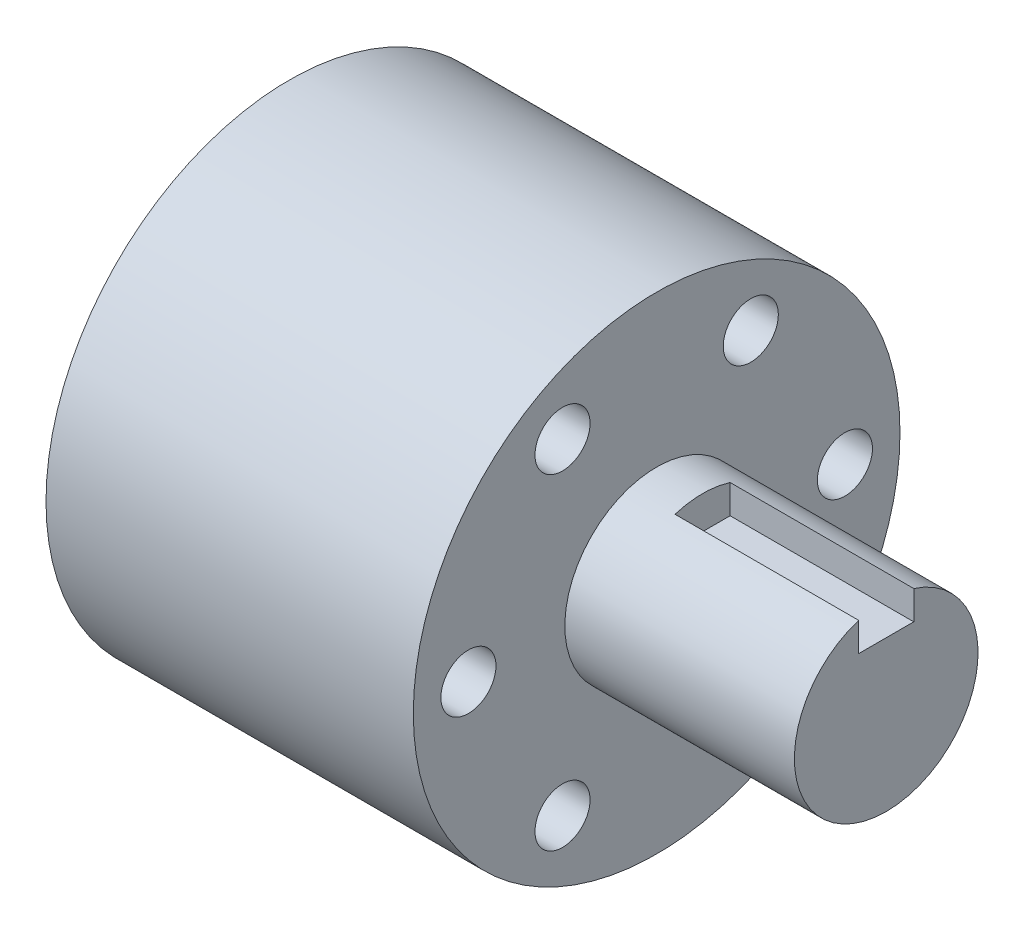
ISO-10303-21;
HEADER;
FILE_DESCRIPTION(('STEP AP214'),'2;1');
FILE_NAME('part.step','',(''),(''),'','','');
FILE_SCHEMA(('AUTOMOTIVE_DESIGN { 1 0 10303 214 1 1 1 1 }'));
ENDSEC;
DATA;
#1=APPLICATION_CONTEXT('core data for automotive mechanical design processes');
#2=APPLICATION_PROTOCOL_DEFINITION('international standard','automotive_design',2000,#1);
#3=PRODUCT_CONTEXT('',#1,'mechanical');
#4=PRODUCT('Part','Part','',(#3));
#5=PRODUCT_RELATED_PRODUCT_CATEGORY('part','',(#4));
#6=PRODUCT_DEFINITION_FORMATION('','',#4);
#7=PRODUCT_DEFINITION_CONTEXT('part definition',#1,'design');
#8=PRODUCT_DEFINITION('design','',#6,#7);
#9=PRODUCT_DEFINITION_SHAPE('','',#8);
#10=(LENGTH_UNIT() NAMED_UNIT(*) SI_UNIT(.MILLI.,.METRE.));
#11=(NAMED_UNIT(*) PLANE_ANGLE_UNIT() SI_UNIT($,.RADIAN.));
#12=(NAMED_UNIT(*) SI_UNIT($,.STERADIAN.) SOLID_ANGLE_UNIT());
#13=UNCERTAINTY_MEASURE_WITH_UNIT(LENGTH_MEASURE(1.E-05),#10,'distance_accuracy_value','');
#14=(GEOMETRIC_REPRESENTATION_CONTEXT(3) GLOBAL_UNCERTAINTY_ASSIGNED_CONTEXT((#13)) GLOBAL_UNIT_ASSIGNED_CONTEXT((#10,
#11,#12)) REPRESENTATION_CONTEXT('',''));
#15=CARTESIAN_POINT('',(0.,0.,0.));
#16=DIRECTION('',(0.,0.,1.));
#17=DIRECTION('',(1.,0.,0.));
#18=AXIS2_PLACEMENT_3D('',#15,#16,#17);
#19=CARTESIAN_POINT('',(20.,0.,0.));
#20=DIRECTION('',(-1.,0.,0.));
#21=DIRECTION('',(0.,0.,1.));
#22=AXIS2_PLACEMENT_3D('',#19,#20,#21);
#23=CYLINDRICAL_SURFACE('',#22,13.25);
#24=CARTESIAN_POINT('',(20.,0.,0.));
#25=DIRECTION('',(1.,0.,0.));
#26=DIRECTION('',(0.,0.,-1.));
#27=AXIS2_PLACEMENT_3D('',#24,#25,#26);
#28=CIRCLE('',#27,13.25);
#29=CARTESIAN_POINT('',(20.,0.,-13.25));
#30=VERTEX_POINT('',#29);
#31=EDGE_CURVE('E11',#30,#30,#28,.T.);
#32=ORIENTED_EDGE('',*,*,#31,.F.);
#33=EDGE_LOOP('',(#32));
#34=FACE_BOUND('',#33,.T.);
#35=CARTESIAN_POINT('',(0.,0.,0.));
#36=DIRECTION('',(1.,0.,0.));
#37=DIRECTION('',(0.,0.,-1.));
#38=AXIS2_PLACEMENT_3D('',#35,#36,#37);
#39=CIRCLE('',#38,13.25);
#40=CARTESIAN_POINT('',(0.,0.,-13.25));
#41=VERTEX_POINT('',#40);
#42=EDGE_CURVE('E38',#41,#41,#39,.T.);
#43=ORIENTED_EDGE('',*,*,#42,.T.);
#44=EDGE_LOOP('',(#43));
#45=FACE_BOUND('',#44,.T.);
#46=ADVANCED_FACE('F35',(#34,#45),#23,.T.);
#47=CARTESIAN_POINT('',(20.,0.,0.));
#48=DIRECTION('',(1.,0.,0.));
#49=DIRECTION('',(0.,0.,-1.));
#50=AXIS2_PLACEMENT_3D('',#47,#48,#49);
#51=PLANE('',#50);
#52=CARTESIAN_POINT('',(20.,0.,0.));
#53=DIRECTION('',(1.,0.,0.));
#54=DIRECTION('',(0.,0.,-1.));
#55=AXIS2_PLACEMENT_3D('',#52,#53,#54);
#56=CIRCLE('',#55,5.);
#57=CARTESIAN_POINT('',(20.,0.,-5.));
#58=VERTEX_POINT('',#57);
#59=EDGE_CURVE('E106',#58,#58,#56,.T.);
#60=ORIENTED_EDGE('',*,*,#59,.F.);
#61=EDGE_LOOP('',(#60));
#62=FACE_BOUND('',#61,.T.);
#63=CARTESIAN_POINT('',(20.,-8.87676038879051,-5.12499999999998));
#64=DIRECTION('',(1.,0.,0.));
#65=DIRECTION('',(0.,0.,-1.));
#66=AXIS2_PLACEMENT_3D('',#63,#64,#65);
#67=CIRCLE('',#66,1.5);
#68=CARTESIAN_POINT('',(20.,-8.87676038879051,-6.62499999999998));
#69=VERTEX_POINT('',#68);
#70=EDGE_CURVE('E119',#69,#69,#67,.T.);
#71=ORIENTED_EDGE('',*,*,#70,.F.);
#72=EDGE_LOOP('',(#71));
#73=FACE_BOUND('',#72,.T.);
#74=CARTESIAN_POINT('',(20.,-8.87676038879047,5.12500000000004));
#75=DIRECTION('',(1.,0.,0.));
#76=DIRECTION('',(0.,0.,-1.));
#77=AXIS2_PLACEMENT_3D('',#74,#75,#76);
#78=CIRCLE('',#77,1.5);
#79=CARTESIAN_POINT('',(20.,-8.87676038879047,3.62500000000004));
#80=VERTEX_POINT('',#79);
#81=EDGE_CURVE('E125',#80,#80,#78,.T.);
#82=ORIENTED_EDGE('',*,*,#81,.F.);
#83=EDGE_LOOP('',(#82));
#84=FACE_BOUND('',#83,.T.);
#85=CARTESIAN_POINT('',(20.,0.,10.25));
#86=DIRECTION('',(1.,0.,0.));
#87=DIRECTION('',(0.,0.,-1.));
#88=AXIS2_PLACEMENT_3D('',#85,#86,#87);
#89=CIRCLE('',#88,1.5);
#90=CARTESIAN_POINT('',(20.,0.,8.75));
#91=VERTEX_POINT('',#90);
#92=EDGE_CURVE('E131',#91,#91,#89,.T.);
#93=ORIENTED_EDGE('',*,*,#92,.F.);
#94=EDGE_LOOP('',(#93));
#95=FACE_BOUND('',#94,.T.);
#96=CARTESIAN_POINT('',(20.,8.87676038879054,5.12499999999992));
#97=DIRECTION('',(1.,0.,0.));
#98=DIRECTION('',(0.,0.,-1.));
#99=AXIS2_PLACEMENT_3D('',#96,#97,#98);
#100=CIRCLE('',#99,1.5);
#101=CARTESIAN_POINT('',(20.,8.87676038879054,3.62499999999992));
#102=VERTEX_POINT('',#101);
#103=EDGE_CURVE('E137',#102,#102,#100,.T.);
#104=ORIENTED_EDGE('',*,*,#103,.F.);
#105=EDGE_LOOP('',(#104));
#106=FACE_BOUND('',#105,.T.);
#107=CARTESIAN_POINT('',(20.,8.87676038879044,-5.1250000000001));
#108=DIRECTION('',(1.,0.,0.));
#109=DIRECTION('',(0.,0.,-1.));
#110=AXIS2_PLACEMENT_3D('',#107,#108,#109);
#111=CIRCLE('',#110,1.5);
#112=CARTESIAN_POINT('',(20.,8.87676038879044,-6.6250000000001));
#113=VERTEX_POINT('',#112);
#114=EDGE_CURVE('E112',#113,#113,#111,.T.);
#115=ORIENTED_EDGE('',*,*,#114,.F.);
#116=EDGE_LOOP('',(#115));
#117=FACE_BOUND('',#116,.T.);
#118=CARTESIAN_POINT('',(20.,0.,-10.25));
#119=DIRECTION('',(1.,0.,0.));
#120=DIRECTION('',(0.,0.,-1.));
#121=AXIS2_PLACEMENT_3D('',#118,#119,#120);
#122=CIRCLE('',#121,1.5);
#123=CARTESIAN_POINT('',(20.,0.,-11.75));
#124=VERTEX_POINT('',#123);
#125=EDGE_CURVE('E118',#124,#124,#122,.T.);
#126=ORIENTED_EDGE('',*,*,#125,.F.);
#127=EDGE_LOOP('',(#126));
#128=FACE_BOUND('',#127,.T.);
#129=ORIENTED_EDGE('',*,*,#31,.T.);
#130=EDGE_LOOP('',(#129));
#131=FACE_BOUND('',#130,.T.);
#132=ADVANCED_FACE('F153',(#62,#73,#84,#95,#106,#117,#128,#131),#51,.T.);
#133=CARTESIAN_POINT('',(0.,0.,0.));
#134=DIRECTION('',(1.,0.,0.));
#135=DIRECTION('',(0.,0.,-1.));
#136=AXIS2_PLACEMENT_3D('',#133,#134,#135);
#137=PLANE('',#136);
#138=ORIENTED_EDGE('',*,*,#42,.F.);
#139=EDGE_LOOP('',(#138));
#140=FACE_BOUND('',#139,.T.);
#141=ADVANCED_FACE('F156',(#140),#137,.F.);
#142=CARTESIAN_POINT('',(15.,0.,-10.25));
#143=DIRECTION('',(1.,0.,0.));
#144=DIRECTION('',(0.,0.,-1.));
#145=AXIS2_PLACEMENT_3D('',#142,#143,#144);
#146=CYLINDRICAL_SURFACE('',#145,1.5);
#147=CARTESIAN_POINT('',(15.,0.,-10.25));
#148=DIRECTION('',(1.,0.,0.));
#149=DIRECTION('',(0.,0.,-1.));
#150=AXIS2_PLACEMENT_3D('',#147,#148,#149);
#151=CIRCLE('',#150,1.5);
#152=CARTESIAN_POINT('',(15.,0.,-11.75));
#153=VERTEX_POINT('',#152);
#154=EDGE_CURVE('E145',#153,#153,#151,.T.);
#155=ORIENTED_EDGE('',*,*,#154,.F.);
#156=EDGE_LOOP('',(#155));
#157=FACE_BOUND('',#156,.T.);
#158=ORIENTED_EDGE('',*,*,#125,.T.);
#159=EDGE_LOOP('',(#158));
#160=FACE_BOUND('',#159,.T.);
#161=ADVANCED_FACE('F151',(#157,#160),#146,.F.);
#162=CARTESIAN_POINT('',(15.,0.,-10.25));
#163=DIRECTION('',(1.,0.,0.));
#164=DIRECTION('',(0.,0.,-1.));
#165=AXIS2_PLACEMENT_3D('',#162,#163,#164);
#166=PLANE('',#165);
#167=ORIENTED_EDGE('',*,*,#154,.T.);
#168=EDGE_LOOP('',(#167));
#169=FACE_BOUND('',#168,.T.);
#170=ADVANCED_FACE('F170',(#169),#166,.T.);
#171=CARTESIAN_POINT('',(15.,8.87676038879044,-5.1250000000001));
#172=DIRECTION('',(1.,0.,0.));
#173=DIRECTION('',(0.,0.,-1.));
#174=AXIS2_PLACEMENT_3D('',#171,#172,#173);
#175=CYLINDRICAL_SURFACE('',#174,1.5);
#176=CARTESIAN_POINT('',(15.,8.87676038879044,-5.1250000000001));
#177=DIRECTION('',(1.,0.,0.));
#178=DIRECTION('',(0.,0.,-1.));
#179=AXIS2_PLACEMENT_3D('',#176,#177,#178);
#180=CIRCLE('',#179,1.5);
#181=CARTESIAN_POINT('',(15.,8.87676038879044,-6.6250000000001));
#182=VERTEX_POINT('',#181);
#183=EDGE_CURVE('E140',#182,#182,#180,.T.);
#184=ORIENTED_EDGE('',*,*,#183,.F.);
#185=EDGE_LOOP('',(#184));
#186=FACE_BOUND('',#185,.T.);
#187=ORIENTED_EDGE('',*,*,#114,.T.);
#188=EDGE_LOOP('',(#187));
#189=FACE_BOUND('',#188,.T.);
#190=ADVANCED_FACE('F176',(#186,#189),#175,.F.);
#191=CARTESIAN_POINT('',(15.,8.87676038879044,-5.1250000000001));
#192=DIRECTION('',(1.,0.,0.));
#193=DIRECTION('',(0.,0.,-1.));
#194=AXIS2_PLACEMENT_3D('',#191,#192,#193);
#195=PLANE('',#194);
#196=ORIENTED_EDGE('',*,*,#183,.T.);
#197=EDGE_LOOP('',(#196));
#198=FACE_BOUND('',#197,.T.);
#199=ADVANCED_FACE('F180',(#198),#195,.T.);
#200=CARTESIAN_POINT('',(15.,8.87676038879054,5.12499999999992));
#201=DIRECTION('',(1.,0.,0.));
#202=DIRECTION('',(0.,0.,-1.));
#203=AXIS2_PLACEMENT_3D('',#200,#201,#202);
#204=CYLINDRICAL_SURFACE('',#203,1.5);
#205=CARTESIAN_POINT('',(15.,8.87676038879054,5.12499999999992));
#206=DIRECTION('',(1.,0.,0.));
#207=DIRECTION('',(0.,0.,-1.));
#208=AXIS2_PLACEMENT_3D('',#205,#206,#207);
#209=CIRCLE('',#208,1.5);
#210=CARTESIAN_POINT('',(15.,8.87676038879054,3.62499999999992));
#211=VERTEX_POINT('',#210);
#212=EDGE_CURVE('E134',#211,#211,#209,.T.);
#213=ORIENTED_EDGE('',*,*,#212,.F.);
#214=EDGE_LOOP('',(#213));
#215=FACE_BOUND('',#214,.T.);
#216=ORIENTED_EDGE('',*,*,#103,.T.);
#217=EDGE_LOOP('',(#216));
#218=FACE_BOUND('',#217,.T.);
#219=ADVANCED_FACE('F184',(#215,#218),#204,.F.);
#220=CARTESIAN_POINT('',(15.,8.87676038879054,5.12499999999992));
#221=DIRECTION('',(1.,0.,0.));
#222=DIRECTION('',(0.,0.,-1.));
#223=AXIS2_PLACEMENT_3D('',#220,#221,#222);
#224=PLANE('',#223);
#225=ORIENTED_EDGE('',*,*,#212,.T.);
#226=EDGE_LOOP('',(#225));
#227=FACE_BOUND('',#226,.T.);
#228=ADVANCED_FACE('F188',(#227),#224,.T.);
#229=CARTESIAN_POINT('',(15.,0.,10.25));
#230=DIRECTION('',(1.,0.,0.));
#231=DIRECTION('',(0.,0.,-1.));
#232=AXIS2_PLACEMENT_3D('',#229,#230,#231);
#233=CYLINDRICAL_SURFACE('',#232,1.5);
#234=CARTESIAN_POINT('',(15.,0.,10.25));
#235=DIRECTION('',(1.,0.,0.));
#236=DIRECTION('',(0.,0.,-1.));
#237=AXIS2_PLACEMENT_3D('',#234,#235,#236);
#238=CIRCLE('',#237,1.5);
#239=CARTESIAN_POINT('',(15.,0.,8.75));
#240=VERTEX_POINT('',#239);
#241=EDGE_CURVE('E128',#240,#240,#238,.T.);
#242=ORIENTED_EDGE('',*,*,#241,.F.);
#243=EDGE_LOOP('',(#242));
#244=FACE_BOUND('',#243,.T.);
#245=ORIENTED_EDGE('',*,*,#92,.T.);
#246=EDGE_LOOP('',(#245));
#247=FACE_BOUND('',#246,.T.);
#248=ADVANCED_FACE('F192',(#244,#247),#233,.F.);
#249=CARTESIAN_POINT('',(15.,0.,10.25));
#250=DIRECTION('',(1.,0.,0.));
#251=DIRECTION('',(0.,0.,-1.));
#252=AXIS2_PLACEMENT_3D('',#249,#250,#251);
#253=PLANE('',#252);
#254=ORIENTED_EDGE('',*,*,#241,.T.);
#255=EDGE_LOOP('',(#254));
#256=FACE_BOUND('',#255,.T.);
#257=ADVANCED_FACE('F196',(#256),#253,.T.);
#258=CARTESIAN_POINT('',(15.,-8.87676038879047,5.12500000000004));
#259=DIRECTION('',(1.,0.,0.));
#260=DIRECTION('',(0.,0.,-1.));
#261=AXIS2_PLACEMENT_3D('',#258,#259,#260);
#262=CYLINDRICAL_SURFACE('',#261,1.5);
#263=CARTESIAN_POINT('',(15.,-8.87676038879047,5.12500000000004));
#264=DIRECTION('',(1.,0.,0.));
#265=DIRECTION('',(0.,0.,-1.));
#266=AXIS2_PLACEMENT_3D('',#263,#264,#265);
#267=CIRCLE('',#266,1.5);
#268=CARTESIAN_POINT('',(15.,-8.87676038879047,3.62500000000004));
#269=VERTEX_POINT('',#268);
#270=EDGE_CURVE('E122',#269,#269,#267,.T.);
#271=ORIENTED_EDGE('',*,*,#270,.F.);
#272=EDGE_LOOP('',(#271));
#273=FACE_BOUND('',#272,.T.);
#274=ORIENTED_EDGE('',*,*,#81,.T.);
#275=EDGE_LOOP('',(#274));
#276=FACE_BOUND('',#275,.T.);
#277=ADVANCED_FACE('F200',(#273,#276),#262,.F.);
#278=CARTESIAN_POINT('',(15.,-8.87676038879047,5.12500000000004));
#279=DIRECTION('',(1.,0.,0.));
#280=DIRECTION('',(0.,0.,-1.));
#281=AXIS2_PLACEMENT_3D('',#278,#279,#280);
#282=PLANE('',#281);
#283=ORIENTED_EDGE('',*,*,#270,.T.);
#284=EDGE_LOOP('',(#283));
#285=FACE_BOUND('',#284,.T.);
#286=ADVANCED_FACE('F204',(#285),#282,.T.);
#287=CARTESIAN_POINT('',(15.,-8.87676038879051,-5.12499999999998));
#288=DIRECTION('',(1.,0.,0.));
#289=DIRECTION('',(0.,0.,-1.));
#290=AXIS2_PLACEMENT_3D('',#287,#288,#289);
#291=CYLINDRICAL_SURFACE('',#290,1.5);
#292=CARTESIAN_POINT('',(15.,-8.87676038879051,-5.12499999999998));
#293=DIRECTION('',(1.,0.,0.));
#294=DIRECTION('',(0.,0.,-1.));
#295=AXIS2_PLACEMENT_3D('',#292,#293,#294);
#296=CIRCLE('',#295,1.5);
#297=CARTESIAN_POINT('',(15.,-8.87676038879051,-6.62499999999998));
#298=VERTEX_POINT('',#297);
#299=EDGE_CURVE('E115',#298,#298,#296,.T.);
#300=ORIENTED_EDGE('',*,*,#299,.F.);
#301=EDGE_LOOP('',(#300));
#302=FACE_BOUND('',#301,.T.);
#303=ORIENTED_EDGE('',*,*,#70,.T.);
#304=EDGE_LOOP('',(#303));
#305=FACE_BOUND('',#304,.T.);
#306=ADVANCED_FACE('F208',(#302,#305),#291,.F.);
#307=CARTESIAN_POINT('',(15.,-8.87676038879051,-5.12499999999998));
#308=DIRECTION('',(1.,0.,0.));
#309=DIRECTION('',(0.,0.,-1.));
#310=AXIS2_PLACEMENT_3D('',#307,#308,#309);
#311=PLANE('',#310);
#312=ORIENTED_EDGE('',*,*,#299,.T.);
#313=EDGE_LOOP('',(#312));
#314=FACE_BOUND('',#313,.T.);
#315=ADVANCED_FACE('F212',(#314),#311,.T.);
#316=CARTESIAN_POINT('',(32.5,0.,0.));
#317=DIRECTION('',(-1.,0.,0.));
#318=DIRECTION('',(0.,0.,1.));
#319=AXIS2_PLACEMENT_3D('',#316,#317,#318);
#320=CYLINDRICAL_SURFACE('',#319,5.);
#321=CARTESIAN_POINT('',(32.5,0.,0.));
#322=DIRECTION('',(1.,0.,0.));
#323=DIRECTION('',(0.,0.,-1.));
#324=AXIS2_PLACEMENT_3D('',#321,#322,#323);
#325=CIRCLE('',#324,5.);
#326=CARTESIAN_POINT('',(32.5,4.76969600708473,1.5));
#327=VERTEX_POINT('',#326);
#328=CARTESIAN_POINT('',(32.5,4.76969600708473,-1.5));
#329=VERTEX_POINT('',#328);
#330=EDGE_CURVE('E109',#327,#329,#325,.T.);
#331=ORIENTED_EDGE('',*,*,#330,.F.);
#332=DIRECTION('',(1.,0.,0.));
#333=VECTOR('',#332,1.);
#334=CARTESIAN_POINT('',(22.5,4.76969600708473,1.5));
#335=LINE('',#334,#333);
#336=CARTESIAN_POINT('',(22.5,4.76969600708473,1.5));
#337=VERTEX_POINT('',#336);
#338=EDGE_CURVE('E70',#337,#327,#335,.T.);
#339=ORIENTED_EDGE('',*,*,#338,.F.);
#340=CARTESIAN_POINT('',(22.5,0.,0.));
#341=DIRECTION('',(1.,0.,0.));
#342=DIRECTION('',(0.,0.,-1.));
#343=AXIS2_PLACEMENT_3D('',#340,#341,#342);
#344=CIRCLE('',#343,5.);
#345=CARTESIAN_POINT('',(22.5,4.76969600708473,-1.5));
#346=VERTEX_POINT('',#345);
#347=EDGE_CURVE('E94',#346,#337,#344,.T.);
#348=ORIENTED_EDGE('',*,*,#347,.F.);
#349=DIRECTION('',(1.,0.,0.));
#350=VECTOR('',#349,1.);
#351=CARTESIAN_POINT('',(22.5,4.76969600708473,-1.5));
#352=LINE('',#351,#350);
#353=EDGE_CURVE('E86',#346,#329,#352,.T.);
#354=ORIENTED_EDGE('',*,*,#353,.T.);
#355=EDGE_LOOP('',(#331,#339,#348,#354));
#356=FACE_BOUND('',#355,.T.);
#357=ORIENTED_EDGE('',*,*,#59,.T.);
#358=EDGE_LOOP('',(#357));
#359=FACE_BOUND('',#358,.T.);
#360=ADVANCED_FACE('F216',(#356,#359),#320,.T.);
#361=CARTESIAN_POINT('',(32.5,0.,0.));
#362=DIRECTION('',(1.,0.,0.));
#363=DIRECTION('',(0.,0.,-1.));
#364=AXIS2_PLACEMENT_3D('',#361,#362,#363);
#365=PLANE('',#364);
#366=DIRECTION('',(0.,-1.,0.));
#367=VECTOR('',#366,1.);
#368=CARTESIAN_POINT('',(32.5,3.2,1.5));
#369=LINE('',#368,#367);
#370=CARTESIAN_POINT('',(32.5,3.2,1.5));
#371=VERTEX_POINT('',#370);
#372=EDGE_CURVE('E49',#327,#371,#369,.T.);
#373=ORIENTED_EDGE('',*,*,#372,.F.);
#374=ORIENTED_EDGE('',*,*,#330,.T.);
#375=DIRECTION('',(0.,1.,0.));
#376=VECTOR('',#375,1.);
#377=CARTESIAN_POINT('',(32.5,3.2,-1.5));
#378=LINE('',#377,#376);
#379=CARTESIAN_POINT('',(32.5,3.2,-1.5));
#380=VERTEX_POINT('',#379);
#381=EDGE_CURVE('E98',#380,#329,#378,.T.);
#382=ORIENTED_EDGE('',*,*,#381,.F.);
#383=DIRECTION('',(0.,0.,-1.));
#384=VECTOR('',#383,1.);
#385=CARTESIAN_POINT('',(32.5,3.2,1.5));
#386=LINE('',#385,#384);
#387=EDGE_CURVE('E83',#371,#380,#386,.T.);
#388=ORIENTED_EDGE('',*,*,#387,.F.);
#389=EDGE_LOOP('',(#373,#374,#382,#388));
#390=FACE_BOUND('',#389,.T.);
#391=ADVANCED_FACE('F220',(#390),#365,.T.);
#392=CARTESIAN_POINT('',(22.5,3.2,1.5));
#393=DIRECTION('',(0.,0.,1.));
#394=DIRECTION('',(0.,-1.,0.));
#395=AXIS2_PLACEMENT_3D('',#392,#393,#394);
#396=PLANE('',#395);
#397=ORIENTED_EDGE('',*,*,#372,.T.);
#398=DIRECTION('',(1.,0.,0.));
#399=VECTOR('',#398,1.);
#400=CARTESIAN_POINT('',(22.5,3.2,1.5));
#401=LINE('',#400,#399);
#402=CARTESIAN_POINT('',(22.5,3.2,1.5));
#403=VERTEX_POINT('',#402);
#404=EDGE_CURVE('E72',#403,#371,#401,.T.);
#405=ORIENTED_EDGE('',*,*,#404,.F.);
#406=DIRECTION('',(0.,-1.,0.));
#407=VECTOR('',#406,1.);
#408=CARTESIAN_POINT('',(22.5,3.2,1.5));
#409=LINE('',#408,#407);
#410=EDGE_CURVE('E55',#337,#403,#409,.T.);
#411=ORIENTED_EDGE('',*,*,#410,.F.);
#412=ORIENTED_EDGE('',*,*,#338,.T.);
#413=EDGE_LOOP('',(#397,#405,#411,#412));
#414=FACE_BOUND('',#413,.T.);
#415=ADVANCED_FACE('F224',(#414),#396,.F.);
#416=CARTESIAN_POINT('',(22.5,3.2,-1.5));
#417=DIRECTION('',(0.,0.,-1.));
#418=DIRECTION('',(-1.,0.,0.));
#419=AXIS2_PLACEMENT_3D('',#416,#417,#418);
#420=PLANE('',#419);
#421=ORIENTED_EDGE('',*,*,#381,.T.);
#422=ORIENTED_EDGE('',*,*,#353,.F.);
#423=DIRECTION('',(0.,1.,0.));
#424=VECTOR('',#423,1.);
#425=CARTESIAN_POINT('',(22.5,3.2,-1.5));
#426=LINE('',#425,#424);
#427=CARTESIAN_POINT('',(22.5,3.2,-1.5));
#428=VERTEX_POINT('',#427);
#429=EDGE_CURVE('E89',#428,#346,#426,.T.);
#430=ORIENTED_EDGE('',*,*,#429,.F.);
#431=DIRECTION('',(1.,0.,0.));
#432=VECTOR('',#431,1.);
#433=CARTESIAN_POINT('',(22.5,3.2,-1.5));
#434=LINE('',#433,#432);
#435=EDGE_CURVE('E77',#428,#380,#434,.T.);
#436=ORIENTED_EDGE('',*,*,#435,.T.);
#437=EDGE_LOOP('',(#421,#422,#430,#436));
#438=FACE_BOUND('',#437,.T.);
#439=ADVANCED_FACE('F90',(#438),#420,.F.);
#440=CARTESIAN_POINT('',(22.5,3.2,1.5));
#441=DIRECTION('',(0.,-1.,0.));
#442=DIRECTION('',(0.,0.,-1.));
#443=AXIS2_PLACEMENT_3D('',#440,#441,#442);
#444=PLANE('',#443);
#445=ORIENTED_EDGE('',*,*,#387,.T.);
#446=ORIENTED_EDGE('',*,*,#435,.F.);
#447=DIRECTION('',(0.,0.,-1.));
#448=VECTOR('',#447,1.);
#449=CARTESIAN_POINT('',(22.5,3.2,1.5));
#450=LINE('',#449,#448);
#451=EDGE_CURVE('E81',#403,#428,#450,.T.);
#452=ORIENTED_EDGE('',*,*,#451,.F.);
#453=ORIENTED_EDGE('',*,*,#404,.T.);
#454=EDGE_LOOP('',(#445,#446,#452,#453));
#455=FACE_BOUND('',#454,.T.);
#456=ADVANCED_FACE('F79',(#455),#444,.F.);
#457=CARTESIAN_POINT('',(22.5,0.,0.));
#458=DIRECTION('',(1.,0.,0.));
#459=DIRECTION('',(0.,0.,-1.));
#460=AXIS2_PLACEMENT_3D('',#457,#458,#459);
#461=PLANE('',#460);
#462=ORIENTED_EDGE('',*,*,#410,.T.);
#463=ORIENTED_EDGE('',*,*,#451,.T.);
#464=ORIENTED_EDGE('',*,*,#429,.T.);
#465=ORIENTED_EDGE('',*,*,#347,.T.);
#466=EDGE_LOOP('',(#462,#463,#464,#465));
#467=FACE_BOUND('',#466,.T.);
#468=ADVANCED_FACE('F96',(#467),#461,.T.);
#469=CLOSED_SHELL('',(#46,#132,#141,#161,#170,#190,#199,#219,#228,#248,#257,#277,#286,#306,#315,
#360,#391,#415,#439,#456,#468));
#470=MANIFOLD_SOLID_BREP('B2',#469);
#471=ADVANCED_BREP_SHAPE_REPRESENTATION('',(#18,#470),#14);
#472=SHAPE_DEFINITION_REPRESENTATION(#9,#471);
ENDSEC;
END-ISO-10303-21;
